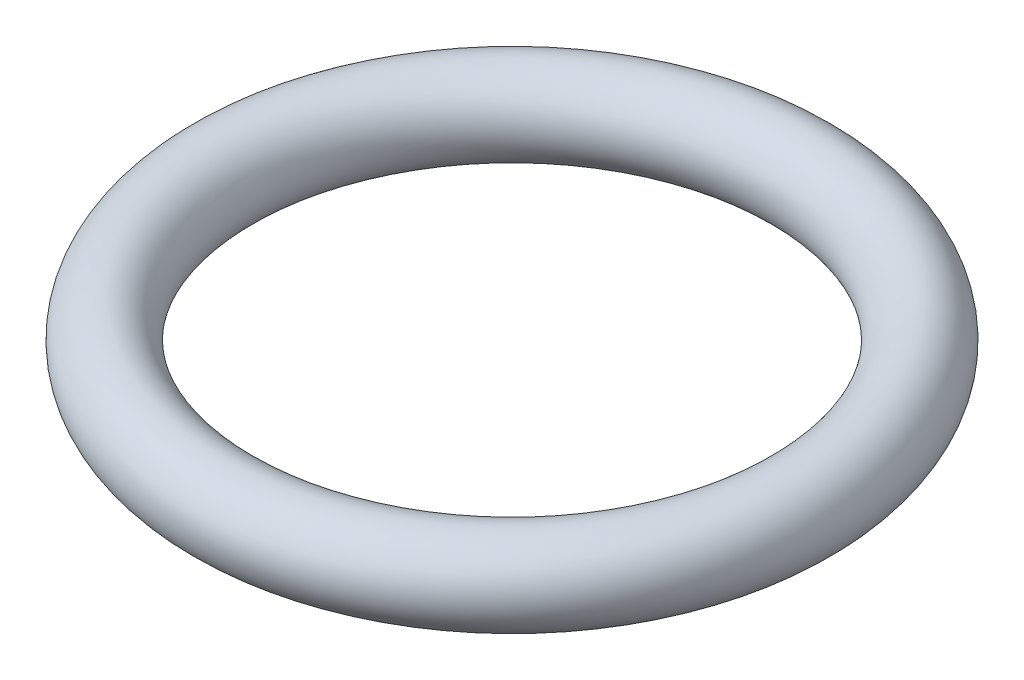
ISO-10303-21;
HEADER;
FILE_DESCRIPTION(('STEP AP214'),'2;1');
FILE_NAME('part.step','',(''),(''),'','','');
FILE_SCHEMA(('AUTOMOTIVE_DESIGN { 1 0 10303 214 1 1 1 1 }'));
ENDSEC;
DATA;
#1=APPLICATION_CONTEXT('core data for automotive mechanical design processes');
#2=APPLICATION_PROTOCOL_DEFINITION('international standard','automotive_design',2000,#1);
#3=PRODUCT_CONTEXT('',#1,'mechanical');
#4=PRODUCT('Part','Part','',(#3));
#5=PRODUCT_RELATED_PRODUCT_CATEGORY('part','',(#4));
#6=PRODUCT_DEFINITION_FORMATION('','',#4);
#7=PRODUCT_DEFINITION_CONTEXT('part definition',#1,'design');
#8=PRODUCT_DEFINITION('design','',#6,#7);
#9=PRODUCT_DEFINITION_SHAPE('','',#8);
#10=(LENGTH_UNIT() NAMED_UNIT(*) SI_UNIT(.MILLI.,.METRE.));
#11=(NAMED_UNIT(*) PLANE_ANGLE_UNIT() SI_UNIT($,.RADIAN.));
#12=(NAMED_UNIT(*) SI_UNIT($,.STERADIAN.) SOLID_ANGLE_UNIT());
#13=UNCERTAINTY_MEASURE_WITH_UNIT(LENGTH_MEASURE(1.E-05),#10,'distance_accuracy_value','');
#14=(GEOMETRIC_REPRESENTATION_CONTEXT(3) GLOBAL_UNCERTAINTY_ASSIGNED_CONTEXT((#13)) GLOBAL_UNIT_ASSIGNED_CONTEXT((#10,
#11,#12)) REPRESENTATION_CONTEXT('',''));
#15=CARTESIAN_POINT('',(0.,0.,0.));
#16=DIRECTION('',(0.,0.,1.));
#17=DIRECTION('',(1.,0.,0.));
#18=AXIS2_PLACEMENT_3D('',#15,#16,#17);
#19=CARTESIAN_POINT('',(0.,0.,0.));
#20=DIRECTION('',(0.,1.,0.));
#21=DIRECTION('',(0.,0.,1.));
#22=AXIS2_PLACEMENT_3D('',#19,#20,#21);
#23=TOROIDAL_SURFACE('',#22,3.5,0.499999999999999);
#24=CARTESIAN_POINT('',(0.,0.,4.));
#25=VERTEX_POINT('',#24);
#26=VERTEX_LOOP('',#25);
#27=FACE_BOUND('',#26,.T.);
#28=ADVANCED_FACE('F29',(#27),#23,.T.);
#29=CLOSED_SHELL('',(#28));
#30=MANIFOLD_SOLID_BREP('B2',#29);
#31=ADVANCED_BREP_SHAPE_REPRESENTATION('',(#18,#30),#14);
#32=SHAPE_DEFINITION_REPRESENTATION(#9,#31);
ENDSEC;
END-ISO-10303-21;
